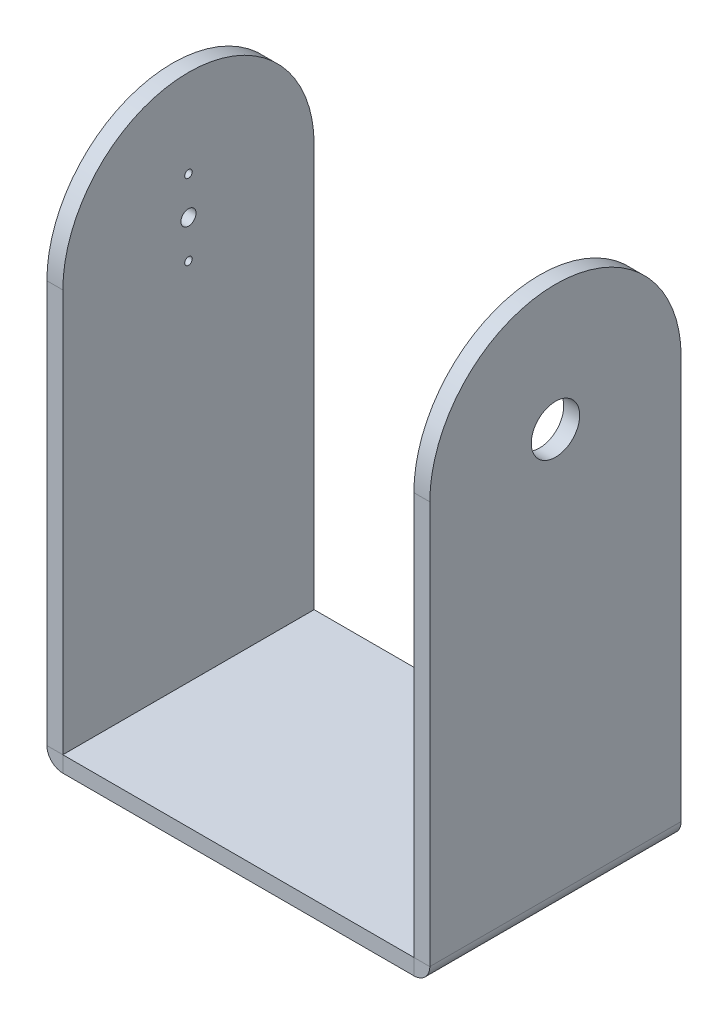
ISO-10303-21;
HEADER;
FILE_DESCRIPTION(('STEP AP214'),'2;1');
FILE_NAME('part.step','',(''),(''),'','','');
FILE_SCHEMA(('AUTOMOTIVE_DESIGN { 1 0 10303 214 1 1 1 1 }'));
ENDSEC;
DATA;
#1=APPLICATION_CONTEXT('core data for automotive mechanical design processes');
#2=APPLICATION_PROTOCOL_DEFINITION('international standard','automotive_design',2000,#1);
#3=PRODUCT_CONTEXT('',#1,'mechanical');
#4=PRODUCT('Part','Part','',(#3));
#5=PRODUCT_RELATED_PRODUCT_CATEGORY('part','',(#4));
#6=PRODUCT_DEFINITION_FORMATION('','',#4);
#7=PRODUCT_DEFINITION_CONTEXT('part definition',#1,'design');
#8=PRODUCT_DEFINITION('design','',#6,#7);
#9=PRODUCT_DEFINITION_SHAPE('','',#8);
#10=(LENGTH_UNIT() NAMED_UNIT(*) SI_UNIT(.MILLI.,.METRE.));
#11=(NAMED_UNIT(*) PLANE_ANGLE_UNIT() SI_UNIT($,.RADIAN.));
#12=(NAMED_UNIT(*) SI_UNIT($,.STERADIAN.) SOLID_ANGLE_UNIT());
#13=UNCERTAINTY_MEASURE_WITH_UNIT(LENGTH_MEASURE(1.E-05),#10,'distance_accuracy_value','');
#14=(GEOMETRIC_REPRESENTATION_CONTEXT(3) GLOBAL_UNCERTAINTY_ASSIGNED_CONTEXT((#13)) GLOBAL_UNIT_ASSIGNED_CONTEXT((#10,
#11,#12)) REPRESENTATION_CONTEXT('',''));
#15=CARTESIAN_POINT('',(0.,0.,0.));
#16=DIRECTION('',(0.,0.,1.));
#17=DIRECTION('',(1.,0.,0.));
#18=AXIS2_PLACEMENT_3D('',#15,#16,#17);
#19=CARTESIAN_POINT('',(-38.0950000000001,-44.918,0.));
#20=DIRECTION('',(1.,0.,0.));
#21=DIRECTION('',(0.,0.,1.));
#22=AXIS2_PLACEMENT_3D('',#19,#20,#21);
#23=PLANE('',#22);
#24=CARTESIAN_POINT('',(-38.0949999999997,72.582,25.));
#25=DIRECTION('',(-1.,0.,0.));
#26=DIRECTION('',(0.,-1.,0.));
#27=AXIS2_PLACEMENT_3D('',#24,#25,#26);
#28=CIRCLE('',#27,0.750000000000002);
#29=CARTESIAN_POINT('',(-38.0949999999997,71.832,25.));
#30=VERTEX_POINT('',#29);
#31=EDGE_CURVE('E228',#30,#30,#28,.T.);
#32=ORIENTED_EDGE('',*,*,#31,.F.);
#33=EDGE_LOOP('',(#32));
#34=FACE_BOUND('',#33,.T.);
#35=CARTESIAN_POINT('',(-38.0949999999997,87.582,25.));
#36=DIRECTION('',(-1.,0.,0.));
#37=DIRECTION('',(0.,-1.,0.));
#38=AXIS2_PLACEMENT_3D('',#35,#36,#37);
#39=CIRCLE('',#38,0.750000000000002);
#40=CARTESIAN_POINT('',(-38.0949999999997,86.832,25.));
#41=VERTEX_POINT('',#40);
#42=EDGE_CURVE('E218',#41,#41,#39,.T.);
#43=ORIENTED_EDGE('',*,*,#42,.F.);
#44=EDGE_LOOP('',(#43));
#45=FACE_BOUND('',#44,.T.);
#46=CARTESIAN_POINT('',(-38.0949999999997,80.082,25.));
#47=DIRECTION('',(-1.,0.,0.));
#48=DIRECTION('',(0.,-1.,0.));
#49=AXIS2_PLACEMENT_3D('',#46,#47,#48);
#50=CIRCLE('',#49,1.5);
#51=CARTESIAN_POINT('',(-38.0949999999997,78.582,25.));
#52=VERTEX_POINT('',#51);
#53=EDGE_CURVE('E215',#52,#52,#50,.T.);
#54=ORIENTED_EDGE('',*,*,#53,.F.);
#55=EDGE_LOOP('',(#54));
#56=FACE_BOUND('',#55,.T.);
#57=DIRECTION('',(0.,-1.,0.));
#58=VECTOR('',#57,1.);
#59=CARTESIAN_POINT('',(-38.0949999999996,105.082,50.));
#60=LINE('',#59,#58);
#61=CARTESIAN_POINT('',(-38.0949999999997,80.082,50.));
#62=VERTEX_POINT('',#61);
#63=CARTESIAN_POINT('',(-38.095,0.00100000000002876,50.));
#64=VERTEX_POINT('',#63);
#65=EDGE_CURVE('E157',#62,#64,#60,.T.);
#66=ORIENTED_EDGE('',*,*,#65,.F.);
#67=CARTESIAN_POINT('',(-38.0949999999997,80.082,25.));
#68=DIRECTION('',(1.,0.,0.));
#69=DIRECTION('',(0.,1.,0.));
#70=AXIS2_PLACEMENT_3D('',#67,#68,#69);
#71=CIRCLE('',#70,25.);
#72=CARTESIAN_POINT('',(-38.0949999999997,80.082,0.));
#73=VERTEX_POINT('',#72);
#74=EDGE_CURVE('E140',#73,#62,#71,.T.);
#75=ORIENTED_EDGE('',*,*,#74,.F.);
#76=DIRECTION('',(0.,1.,0.));
#77=VECTOR('',#76,1.);
#78=CARTESIAN_POINT('',(-38.0949999999996,105.082,0.));
#79=LINE('',#78,#77);
#80=CARTESIAN_POINT('',(-38.095,0.00100000000000881,0.));
#81=VERTEX_POINT('',#80);
#82=EDGE_CURVE('E179',#81,#73,#79,.T.);
#83=ORIENTED_EDGE('',*,*,#82,.F.);
#84=DIRECTION('',(0.,0.,-1.));
#85=VECTOR('',#84,1.);
#86=CARTESIAN_POINT('',(-38.095,0.00100000000002182,0.));
#87=LINE('',#86,#85);
#88=EDGE_CURVE('E162',#64,#81,#87,.T.);
#89=ORIENTED_EDGE('',*,*,#88,.F.);
#90=EDGE_LOOP('',(#66,#75,#83,#89));
#91=FACE_BOUND('',#90,.T.);
#92=ADVANCED_FACE('F44',(#34,#45,#56,#91),#23,.F.);
#93=CARTESIAN_POINT('',(-34.9200000000002,-44.918,0.));
#94=DIRECTION('',(1.,0.,0.));
#95=DIRECTION('',(0.,0.,1.));
#96=AXIS2_PLACEMENT_3D('',#93,#94,#95);
#97=PLANE('',#96);
#98=CARTESIAN_POINT('',(-34.9199999999997,72.582,25.));
#99=DIRECTION('',(1.,0.,0.));
#100=DIRECTION('',(0.,1.,0.));
#101=AXIS2_PLACEMENT_3D('',#98,#99,#100);
#102=CIRCLE('',#101,0.750000000000002);
#103=CARTESIAN_POINT('',(-34.9199999999997,73.332,25.));
#104=VERTEX_POINT('',#103);
#105=EDGE_CURVE('E48',#104,#104,#102,.T.);
#106=ORIENTED_EDGE('',*,*,#105,.F.);
#107=EDGE_LOOP('',(#106));
#108=FACE_BOUND('',#107,.T.);
#109=CARTESIAN_POINT('',(-34.9199999999997,87.582,25.));
#110=DIRECTION('',(1.,0.,0.));
#111=DIRECTION('',(0.,1.,0.));
#112=AXIS2_PLACEMENT_3D('',#109,#110,#111);
#113=CIRCLE('',#112,0.750000000000002);
#114=CARTESIAN_POINT('',(-34.9199999999997,88.332,25.));
#115=VERTEX_POINT('',#114);
#116=EDGE_CURVE('E216',#115,#115,#113,.T.);
#117=ORIENTED_EDGE('',*,*,#116,.F.);
#118=EDGE_LOOP('',(#117));
#119=FACE_BOUND('',#118,.T.);
#120=CARTESIAN_POINT('',(-34.9199999999997,80.082,25.));
#121=DIRECTION('',(1.,0.,0.));
#122=DIRECTION('',(0.,1.,0.));
#123=AXIS2_PLACEMENT_3D('',#120,#121,#122);
#124=CIRCLE('',#123,1.5);
#125=CARTESIAN_POINT('',(-34.9199999999997,81.582,25.));
#126=VERTEX_POINT('',#125);
#127=EDGE_CURVE('E213',#126,#126,#124,.T.);
#128=ORIENTED_EDGE('',*,*,#127,.F.);
#129=EDGE_LOOP('',(#128));
#130=FACE_BOUND('',#129,.T.);
#131=CARTESIAN_POINT('',(-34.9199999999997,80.082,25.));
#132=DIRECTION('',(1.,0.,0.));
#133=DIRECTION('',(0.,1.,0.));
#134=AXIS2_PLACEMENT_3D('',#131,#132,#133);
#135=CIRCLE('',#134,25.);
#136=CARTESIAN_POINT('',(-34.9199999999997,80.082,0.));
#137=VERTEX_POINT('',#136);
#138=CARTESIAN_POINT('',(-34.9199999999998,80.082,50.));
#139=VERTEX_POINT('',#138);
#140=EDGE_CURVE('E69',#137,#139,#135,.T.);
#141=ORIENTED_EDGE('',*,*,#140,.T.);
#142=DIRECTION('',(0.,-1.,0.));
#143=VECTOR('',#142,1.);
#144=CARTESIAN_POINT('',(-34.9199999999996,105.082,50.));
#145=LINE('',#144,#143);
#146=CARTESIAN_POINT('',(-34.92,0.00100000000001488,50.));
#147=VERTEX_POINT('',#146);
#148=EDGE_CURVE('E137',#139,#147,#145,.T.);
#149=ORIENTED_EDGE('',*,*,#148,.T.);
#150=DIRECTION('',(0.,0.,-1.));
#151=VECTOR('',#150,1.);
#152=CARTESIAN_POINT('',(-34.92,0.00100000000000794,0.));
#153=LINE('',#152,#151);
#154=CARTESIAN_POINT('',(-34.92,0.00100000000001488,0.));
#155=VERTEX_POINT('',#154);
#156=EDGE_CURVE('E154',#147,#155,#153,.T.);
#157=ORIENTED_EDGE('',*,*,#156,.T.);
#158=DIRECTION('',(0.,1.,0.));
#159=VECTOR('',#158,1.);
#160=CARTESIAN_POINT('',(-34.9199999999996,105.082,0.));
#161=LINE('',#160,#159);
#162=EDGE_CURVE('E139',#155,#137,#161,.T.);
#163=ORIENTED_EDGE('',*,*,#162,.T.);
#164=EDGE_LOOP('',(#141,#149,#157,#163));
#165=FACE_BOUND('',#164,.T.);
#166=ADVANCED_FACE('F134',(#108,#119,#130,#165),#97,.T.);
#167=CARTESIAN_POINT('',(38.0950000000002,-44.918,0.));
#168=DIRECTION('',(-1.,0.,0.));
#169=DIRECTION('',(0.,0.,1.));
#170=AXIS2_PLACEMENT_3D('',#167,#168,#169);
#171=PLANE('',#170);
#172=CARTESIAN_POINT('',(38.0949999999997,80.082,25.));
#173=DIRECTION('',(1.,0.,0.));
#174=DIRECTION('',(0.,1.,0.));
#175=AXIS2_PLACEMENT_3D('',#172,#173,#174);
#176=CIRCLE('',#175,4.815);
#177=CARTESIAN_POINT('',(38.0949999999997,84.897,25.));
#178=VERTEX_POINT('',#177);
#179=EDGE_CURVE('E212',#178,#178,#176,.T.);
#180=ORIENTED_EDGE('',*,*,#179,.F.);
#181=EDGE_LOOP('',(#180));
#182=FACE_BOUND('',#181,.T.);
#183=CARTESIAN_POINT('',(38.0949999999997,80.0819999999998,24.9999999999999));
#184=DIRECTION('',(-1.,0.,0.));
#185=DIRECTION('',(0.,-1.,0.));
#186=AXIS2_PLACEMENT_3D('',#183,#184,#185);
#187=CIRCLE('',#186,25.);
#188=CARTESIAN_POINT('',(38.0949999999997,80.0819999999998,49.9999999999999));
#189=VERTEX_POINT('',#188);
#190=CARTESIAN_POINT('',(38.0949999999997,80.0819999999998,0.));
#191=VERTEX_POINT('',#190);
#192=EDGE_CURVE('E323',#189,#191,#187,.T.);
#193=ORIENTED_EDGE('',*,*,#192,.F.);
#194=DIRECTION('',(0.,1.,0.));
#195=VECTOR('',#194,1.);
#196=CARTESIAN_POINT('',(38.0950000000007,-194.918,50.));
#197=LINE('',#196,#195);
#198=CARTESIAN_POINT('',(38.095,0.00100000000001575,50.));
#199=VERTEX_POINT('',#198);
#200=EDGE_CURVE('E234',#199,#189,#197,.T.);
#201=ORIENTED_EDGE('',*,*,#200,.F.);
#202=DIRECTION('',(0.,0.,-1.));
#203=VECTOR('',#202,1.);
#204=CARTESIAN_POINT('',(38.095,0.001000000000001,0.));
#205=LINE('',#204,#203);
#206=CARTESIAN_POINT('',(38.095,0.00100000000001488,0.));
#207=VERTEX_POINT('',#206);
#208=EDGE_CURVE('E245',#199,#207,#205,.T.);
#209=ORIENTED_EDGE('',*,*,#208,.T.);
#210=DIRECTION('',(0.,-1.,0.));
#211=VECTOR('',#210,1.);
#212=CARTESIAN_POINT('',(38.0950000000007,-194.918,0.));
#213=LINE('',#212,#211);
#214=EDGE_CURVE('E243',#191,#207,#213,.T.);
#215=ORIENTED_EDGE('',*,*,#214,.F.);
#216=EDGE_LOOP('',(#193,#201,#209,#215));
#217=FACE_BOUND('',#216,.T.);
#218=ADVANCED_FACE('F321',(#182,#217),#171,.F.);
#219=CARTESIAN_POINT('',(34.9200000000002,-44.918,0.));
#220=DIRECTION('',(-1.,0.,0.));
#221=DIRECTION('',(0.,0.,1.));
#222=AXIS2_PLACEMENT_3D('',#219,#220,#221);
#223=PLANE('',#222);
#224=CARTESIAN_POINT('',(34.9199999999997,80.082,25.));
#225=DIRECTION('',(-1.,0.,0.));
#226=DIRECTION('',(0.,-1.,0.));
#227=AXIS2_PLACEMENT_3D('',#224,#225,#226);
#228=CIRCLE('',#227,4.815);
#229=CARTESIAN_POINT('',(34.9199999999997,75.267,25.));
#230=VERTEX_POINT('',#229);
#231=EDGE_CURVE('E208',#230,#230,#228,.T.);
#232=ORIENTED_EDGE('',*,*,#231,.F.);
#233=EDGE_LOOP('',(#232));
#234=FACE_BOUND('',#233,.T.);
#235=DIRECTION('',(0.,1.,0.));
#236=VECTOR('',#235,1.);
#237=CARTESIAN_POINT('',(34.9200000000007,-194.918,50.));
#238=LINE('',#237,#236);
#239=CARTESIAN_POINT('',(34.92,0.000999999999994061,50.));
#240=VERTEX_POINT('',#239);
#241=CARTESIAN_POINT('',(34.9199999999998,80.0819999999997,49.9999999999999));
#242=VERTEX_POINT('',#241);
#243=EDGE_CURVE('E240',#240,#242,#238,.T.);
#244=ORIENTED_EDGE('',*,*,#243,.T.);
#245=CARTESIAN_POINT('',(34.9199999999997,80.0819999999997,24.9999999999999));
#246=DIRECTION('',(-1.,0.,0.));
#247=DIRECTION('',(0.,-1.,0.));
#248=AXIS2_PLACEMENT_3D('',#245,#246,#247);
#249=CIRCLE('',#248,25.);
#250=CARTESIAN_POINT('',(34.9199999999997,80.0819999999997,0.));
#251=VERTEX_POINT('',#250);
#252=EDGE_CURVE('E325',#242,#251,#249,.T.);
#253=ORIENTED_EDGE('',*,*,#252,.T.);
#254=DIRECTION('',(0.,-1.,0.));
#255=VECTOR('',#254,1.);
#256=CARTESIAN_POINT('',(34.9200000000007,-194.918,0.));
#257=LINE('',#256,#255);
#258=CARTESIAN_POINT('',(34.92,0.001000000000001,0.));
#259=VERTEX_POINT('',#258);
#260=EDGE_CURVE('E238',#251,#259,#257,.T.);
#261=ORIENTED_EDGE('',*,*,#260,.T.);
#262=DIRECTION('',(0.,0.,-1.));
#263=VECTOR('',#262,1.);
#264=CARTESIAN_POINT('',(34.92,0.000999999999987122,0.));
#265=LINE('',#264,#263);
#266=EDGE_CURVE('E251',#240,#259,#265,.T.);
#267=ORIENTED_EDGE('',*,*,#266,.F.);
#268=EDGE_LOOP('',(#244,#253,#261,#267));
#269=FACE_BOUND('',#268,.T.);
#270=ADVANCED_FACE('F362',(#234,#269),#223,.T.);
#271=CARTESIAN_POINT('',(38.0950000000007,-194.918,50.));
#272=DIRECTION('',(0.,0.,1.));
#273=DIRECTION('',(0.,1.,0.));
#274=AXIS2_PLACEMENT_3D('',#271,#272,#273);
#275=PLANE('',#274);
#276=ORIENTED_EDGE('',*,*,#200,.T.);
#277=DIRECTION('',(-1.,0.,0.));
#278=VECTOR('',#277,1.);
#279=CARTESIAN_POINT('',(34.9199999999998,80.0819999999997,49.9999999999999));
#280=LINE('',#279,#278);
#281=EDGE_CURVE('E148',#242,#189,#280,.F.);
#282=ORIENTED_EDGE('',*,*,#281,.F.);
#283=ORIENTED_EDGE('',*,*,#243,.F.);
#284=DIRECTION('',(-1.,0.,0.));
#285=VECTOR('',#284,1.);
#286=CARTESIAN_POINT('',(38.095,0.00100000000000794,50.));
#287=LINE('',#286,#285);
#288=EDGE_CURVE('E211',#199,#240,#287,.T.);
#289=ORIENTED_EDGE('',*,*,#288,.F.);
#290=EDGE_LOOP('',(#276,#282,#283,#289));
#291=FACE_BOUND('',#290,.T.);
#292=ADVANCED_FACE('F318',(#291),#275,.T.);
#293=CARTESIAN_POINT('',(-38.0949999999996,105.082,0.));
#294=DIRECTION('',(0.,0.,-1.));
#295=DIRECTION('',(0.,1.,0.));
#296=AXIS2_PLACEMENT_3D('',#293,#294,#295);
#297=PLANE('',#296);
#298=ORIENTED_EDGE('',*,*,#82,.T.);
#299=DIRECTION('',(1.,0.,0.));
#300=VECTOR('',#299,1.);
#301=CARTESIAN_POINT('',(-34.9199999999997,80.082,0.));
#302=LINE('',#301,#300);
#303=EDGE_CURVE('E332',#137,#73,#302,.F.);
#304=ORIENTED_EDGE('',*,*,#303,.F.);
#305=ORIENTED_EDGE('',*,*,#162,.F.);
#306=DIRECTION('',(-1.,0.,0.));
#307=VECTOR('',#306,1.);
#308=CARTESIAN_POINT('',(-38.095,0.00100000000002876,0.));
#309=LINE('',#308,#307);
#310=EDGE_CURVE('E267',#155,#81,#309,.T.);
#311=ORIENTED_EDGE('',*,*,#310,.T.);
#312=EDGE_LOOP('',(#298,#304,#305,#311));
#313=FACE_BOUND('',#312,.T.);
#314=ADVANCED_FACE('F271',(#313),#297,.T.);
#315=CARTESIAN_POINT('',(0.,0.,0.));
#316=DIRECTION('',(0.,1.,0.));
#317=DIRECTION('',(0.,0.,1.));
#318=AXIS2_PLACEMENT_3D('',#315,#316,#317);
#319=PLANE('',#318);
#320=DIRECTION('',(1.,0.,0.));
#321=VECTOR('',#320,1.);
#322=CARTESIAN_POINT('',(-150.,0.,50.));
#323=LINE('',#322,#321);
#324=CARTESIAN_POINT('',(-34.919,0.,50.));
#325=VERTEX_POINT('',#324);
#326=CARTESIAN_POINT('',(34.919,0.,50.));
#327=VERTEX_POINT('',#326);
#328=EDGE_CURVE('E203',#325,#327,#323,.T.);
#329=ORIENTED_EDGE('',*,*,#328,.T.);
#330=DIRECTION('',(0.,0.,-1.));
#331=VECTOR('',#330,1.);
#332=CARTESIAN_POINT('',(34.919,0.,0.));
#333=LINE('',#332,#331);
#334=CARTESIAN_POINT('',(34.919,0.,0.));
#335=VERTEX_POINT('',#334);
#336=EDGE_CURVE('E53',#327,#335,#333,.T.);
#337=ORIENTED_EDGE('',*,*,#336,.T.);
#338=DIRECTION('',(-1.,0.,0.));
#339=VECTOR('',#338,1.);
#340=CARTESIAN_POINT('',(-150.,0.,0.));
#341=LINE('',#340,#339);
#342=CARTESIAN_POINT('',(-34.919,0.,0.));
#343=VERTEX_POINT('',#342);
#344=EDGE_CURVE('E173',#335,#343,#341,.T.);
#345=ORIENTED_EDGE('',*,*,#344,.T.);
#346=DIRECTION('',(0.,0.,-1.));
#347=VECTOR('',#346,1.);
#348=CARTESIAN_POINT('',(-34.919,0.,0.));
#349=LINE('',#348,#347);
#350=EDGE_CURVE('E186',#325,#343,#349,.T.);
#351=ORIENTED_EDGE('',*,*,#350,.F.);
#352=EDGE_LOOP('',(#329,#337,#345,#351));
#353=FACE_BOUND('',#352,.T.);
#354=ADVANCED_FACE('F299',(#353),#319,.T.);
#355=CARTESIAN_POINT('',(-150.,-3.175,0.));
#356=DIRECTION('',(0.,0.,-1.));
#357=DIRECTION('',(-1.,0.,0.));
#358=AXIS2_PLACEMENT_3D('',#355,#356,#357);
#359=PLANE('',#358);
#360=ORIENTED_EDGE('',*,*,#344,.F.);
#361=DIRECTION('',(0.,-1.,0.));
#362=VECTOR('',#361,1.);
#363=CARTESIAN_POINT('',(34.919,-3.175,0.));
#364=LINE('',#363,#362);
#365=CARTESIAN_POINT('',(34.919,-3.175,0.));
#366=VERTEX_POINT('',#365);
#367=EDGE_CURVE('E194',#335,#366,#364,.T.);
#368=ORIENTED_EDGE('',*,*,#367,.T.);
#369=DIRECTION('',(-1.,0.,0.));
#370=VECTOR('',#369,1.);
#371=CARTESIAN_POINT('',(-150.,-3.175,0.));
#372=LINE('',#371,#370);
#373=CARTESIAN_POINT('',(-34.919,-3.175,0.));
#374=VERTEX_POINT('',#373);
#375=EDGE_CURVE('E201',#366,#374,#372,.T.);
#376=ORIENTED_EDGE('',*,*,#375,.T.);
#377=DIRECTION('',(0.,-1.,0.));
#378=VECTOR('',#377,1.);
#379=CARTESIAN_POINT('',(-34.919,-3.175,0.));
#380=LINE('',#379,#378);
#381=EDGE_CURVE('E189',#343,#374,#380,.T.);
#382=ORIENTED_EDGE('',*,*,#381,.F.);
#383=EDGE_LOOP('',(#360,#368,#376,#382));
#384=FACE_BOUND('',#383,.T.);
#385=ADVANCED_FACE('F285',(#384),#359,.T.);
#386=CARTESIAN_POINT('',(-150.,-3.175,50.));
#387=DIRECTION('',(0.,0.,1.));
#388=DIRECTION('',(1.,0.,0.));
#389=AXIS2_PLACEMENT_3D('',#386,#387,#388);
#390=PLANE('',#389);
#391=DIRECTION('',(1.,0.,0.));
#392=VECTOR('',#391,1.);
#393=CARTESIAN_POINT('',(-150.,-3.175,50.));
#394=LINE('',#393,#392);
#395=CARTESIAN_POINT('',(-34.919,-3.175,50.));
#396=VERTEX_POINT('',#395);
#397=CARTESIAN_POINT('',(34.919,-3.175,50.));
#398=VERTEX_POINT('',#397);
#399=EDGE_CURVE('E183',#396,#398,#394,.T.);
#400=ORIENTED_EDGE('',*,*,#399,.T.);
#401=DIRECTION('',(0.,1.,0.));
#402=VECTOR('',#401,1.);
#403=CARTESIAN_POINT('',(34.919,-3.175,50.));
#404=LINE('',#403,#402);
#405=EDGE_CURVE('E12',#398,#327,#404,.T.);
#406=ORIENTED_EDGE('',*,*,#405,.T.);
#407=ORIENTED_EDGE('',*,*,#328,.F.);
#408=DIRECTION('',(0.,1.,0.));
#409=VECTOR('',#408,1.);
#410=CARTESIAN_POINT('',(-34.919,-3.175,50.));
#411=LINE('',#410,#409);
#412=EDGE_CURVE('E182',#396,#325,#411,.T.);
#413=ORIENTED_EDGE('',*,*,#412,.F.);
#414=EDGE_LOOP('',(#400,#406,#407,#413));
#415=FACE_BOUND('',#414,.T.);
#416=ADVANCED_FACE('F46',(#415),#390,.T.);
#417=CARTESIAN_POINT('',(0.,-3.175,0.));
#418=DIRECTION('',(0.,1.,0.));
#419=DIRECTION('',(0.,0.,1.));
#420=AXIS2_PLACEMENT_3D('',#417,#418,#419);
#421=PLANE('',#420);
#422=DIRECTION('',(0.,0.,-1.));
#423=VECTOR('',#422,1.);
#424=CARTESIAN_POINT('',(34.919,-3.175,0.));
#425=LINE('',#424,#423);
#426=EDGE_CURVE('E192',#398,#366,#425,.T.);
#427=ORIENTED_EDGE('',*,*,#426,.F.);
#428=ORIENTED_EDGE('',*,*,#399,.F.);
#429=DIRECTION('',(0.,0.,-1.));
#430=VECTOR('',#429,1.);
#431=CARTESIAN_POINT('',(-34.919,-3.175,0.));
#432=LINE('',#431,#430);
#433=EDGE_CURVE('E180',#396,#374,#432,.T.);
#434=ORIENTED_EDGE('',*,*,#433,.T.);
#435=ORIENTED_EDGE('',*,*,#375,.F.);
#436=EDGE_LOOP('',(#427,#428,#434,#435));
#437=FACE_BOUND('',#436,.T.);
#438=ADVANCED_FACE('F289',(#437),#421,.F.);
#439=CARTESIAN_POINT('',(-34.919,0.00100000000000013,50.));
#440=DIRECTION('',(0.,0.,1.));
#441=DIRECTION('',(1.,0.,0.));
#442=AXIS2_PLACEMENT_3D('',#439,#440,#441);
#443=PLANE('',#442);
#444=ORIENTED_EDGE('',*,*,#412,.T.);
#445=CARTESIAN_POINT('',(-34.919,0.00100000000000013,50.));
#446=DIRECTION('',(0.,0.,-1.));
#447=DIRECTION('',(-1.,0.,0.));
#448=AXIS2_PLACEMENT_3D('',#445,#446,#447);
#449=CIRCLE('',#448,0.00100000000000013);
#450=EDGE_CURVE('E176',#325,#147,#449,.T.);
#451=ORIENTED_EDGE('',*,*,#450,.T.);
#452=DIRECTION('',(1.,0.,0.));
#453=VECTOR('',#452,1.);
#454=CARTESIAN_POINT('',(-38.095,0.00100000000002876,50.));
#455=LINE('',#454,#453);
#456=EDGE_CURVE('E152',#64,#147,#455,.T.);
#457=ORIENTED_EDGE('',*,*,#456,.F.);
#458=CARTESIAN_POINT('',(-34.919,0.00100000000000013,50.));
#459=DIRECTION('',(0.,0.,-1.));
#460=DIRECTION('',(1.,0.,0.));
#461=AXIS2_PLACEMENT_3D('',#458,#459,#460);
#462=CIRCLE('',#461,3.176);
#463=EDGE_CURVE('E166',#396,#64,#462,.T.);
#464=ORIENTED_EDGE('',*,*,#463,.F.);
#465=EDGE_LOOP('',(#444,#451,#457,#464));
#466=FACE_BOUND('',#465,.T.);
#467=ADVANCED_FACE('F295',(#466),#443,.T.);
#468=CARTESIAN_POINT('',(-34.919,0.00100000000000013,0.));
#469=DIRECTION('',(0.,0.,-1.));
#470=DIRECTION('',(-1.,0.,0.));
#471=AXIS2_PLACEMENT_3D('',#468,#469,#470);
#472=PLANE('',#471);
#473=ORIENTED_EDGE('',*,*,#310,.F.);
#474=CARTESIAN_POINT('',(-34.919,0.00100000000000013,0.));
#475=DIRECTION('',(0.,0.,-1.));
#476=DIRECTION('',(-1.,0.,0.));
#477=AXIS2_PLACEMENT_3D('',#474,#475,#476);
#478=CIRCLE('',#477,0.00100000000000013);
#479=EDGE_CURVE('E170',#155,#343,#478,.F.);
#480=ORIENTED_EDGE('',*,*,#479,.T.);
#481=ORIENTED_EDGE('',*,*,#381,.T.);
#482=CARTESIAN_POINT('',(-34.919,0.00100000000000013,0.));
#483=DIRECTION('',(0.,0.,1.));
#484=DIRECTION('',(-1.,0.,0.));
#485=AXIS2_PLACEMENT_3D('',#482,#483,#484);
#486=CIRCLE('',#485,3.176);
#487=EDGE_CURVE('E169',#81,#374,#486,.T.);
#488=ORIENTED_EDGE('',*,*,#487,.F.);
#489=EDGE_LOOP('',(#473,#480,#481,#488));
#490=FACE_BOUND('',#489,.T.);
#491=ADVANCED_FACE('F281',(#490),#472,.T.);
#492=CARTESIAN_POINT('',(-34.919,0.00100000000000013,76.0889481688555));
#493=DIRECTION('',(0.,0.,-1.));
#494=DIRECTION('',(-1.,0.,0.));
#495=AXIS2_PLACEMENT_3D('',#492,#493,#494);
#496=CYLINDRICAL_SURFACE('',#495,3.176);
#497=ORIENTED_EDGE('',*,*,#487,.T.);
#498=ORIENTED_EDGE('',*,*,#433,.F.);
#499=ORIENTED_EDGE('',*,*,#463,.T.);
#500=ORIENTED_EDGE('',*,*,#88,.T.);
#501=EDGE_LOOP('',(#497,#498,#499,#500));
#502=FACE_BOUND('',#501,.T.);
#503=ADVANCED_FACE('F278',(#502),#496,.T.);
#504=CARTESIAN_POINT('',(-34.919,0.00100000000000013,76.0889481688555));
#505=DIRECTION('',(0.,0.,-1.));
#506=DIRECTION('',(-1.,0.,0.));
#507=AXIS2_PLACEMENT_3D('',#504,#505,#506);
#508=CYLINDRICAL_SURFACE('',#507,0.00100000000000013);
#509=ORIENTED_EDGE('',*,*,#479,.F.);
#510=ORIENTED_EDGE('',*,*,#156,.F.);
#511=ORIENTED_EDGE('',*,*,#450,.F.);
#512=ORIENTED_EDGE('',*,*,#350,.T.);
#513=EDGE_LOOP('',(#509,#510,#511,#512));
#514=FACE_BOUND('',#513,.T.);
#515=ADVANCED_FACE('F297',(#514),#508,.F.);
#516=CARTESIAN_POINT('',(-38.0949999999996,105.082,50.));
#517=DIRECTION('',(0.,0.,1.));
#518=DIRECTION('',(0.,-1.,0.));
#519=AXIS2_PLACEMENT_3D('',#516,#517,#518);
#520=PLANE('',#519);
#521=DIRECTION('',(1.,0.,0.));
#522=VECTOR('',#521,1.);
#523=CARTESIAN_POINT('',(-34.9199999999998,80.082,50.));
#524=LINE('',#523,#522);
#525=EDGE_CURVE('E143',#139,#62,#524,.F.);
#526=ORIENTED_EDGE('',*,*,#525,.T.);
#527=ORIENTED_EDGE('',*,*,#65,.T.);
#528=ORIENTED_EDGE('',*,*,#456,.T.);
#529=ORIENTED_EDGE('',*,*,#148,.F.);
#530=EDGE_LOOP('',(#526,#527,#528,#529));
#531=FACE_BOUND('',#530,.T.);
#532=ADVANCED_FACE('F150',(#531),#520,.T.);
#533=CARTESIAN_POINT('',(34.919,0.00100000000000013,50.));
#534=DIRECTION('',(0.,0.,1.));
#535=DIRECTION('',(1.,0.,0.));
#536=AXIS2_PLACEMENT_3D('',#533,#534,#535);
#537=PLANE('',#536);
#538=ORIENTED_EDGE('',*,*,#288,.T.);
#539=CARTESIAN_POINT('',(34.919,0.00100000000000013,50.));
#540=DIRECTION('',(0.,0.,1.));
#541=DIRECTION('',(1.,0.,0.));
#542=AXIS2_PLACEMENT_3D('',#539,#540,#541);
#543=CIRCLE('',#542,0.00100000000000013);
#544=EDGE_CURVE('E237',#240,#327,#543,.F.);
#545=ORIENTED_EDGE('',*,*,#544,.T.);
#546=ORIENTED_EDGE('',*,*,#405,.F.);
#547=CARTESIAN_POINT('',(34.919,0.00100000000000013,50.));
#548=DIRECTION('',(0.,0.,-1.));
#549=DIRECTION('',(1.,0.,0.));
#550=AXIS2_PLACEMENT_3D('',#547,#548,#549);
#551=CIRCLE('',#550,3.176);
#552=EDGE_CURVE('E256',#199,#398,#551,.T.);
#553=ORIENTED_EDGE('',*,*,#552,.F.);
#554=EDGE_LOOP('',(#538,#545,#546,#553));
#555=FACE_BOUND('',#554,.T.);
#556=ADVANCED_FACE('F315',(#555),#537,.T.);
#557=CARTESIAN_POINT('',(34.919,0.00100000000000013,0.));
#558=DIRECTION('',(0.,0.,-1.));
#559=DIRECTION('',(-1.,0.,0.));
#560=AXIS2_PLACEMENT_3D('',#557,#558,#559);
#561=PLANE('',#560);
#562=CARTESIAN_POINT('',(34.919,0.00100000000000013,0.));
#563=DIRECTION('',(0.,0.,1.));
#564=DIRECTION('',(1.,0.,0.));
#565=AXIS2_PLACEMENT_3D('',#562,#563,#564);
#566=CIRCLE('',#565,0.00100000000000013);
#567=EDGE_CURVE('E259',#335,#259,#566,.T.);
#568=ORIENTED_EDGE('',*,*,#567,.T.);
#569=DIRECTION('',(1.,0.,0.));
#570=VECTOR('',#569,1.);
#571=CARTESIAN_POINT('',(38.095,0.00100000000001488,0.));
#572=LINE('',#571,#570);
#573=EDGE_CURVE('E248',#259,#207,#572,.T.);
#574=ORIENTED_EDGE('',*,*,#573,.T.);
#575=CARTESIAN_POINT('',(34.919,0.00100000000000013,0.));
#576=DIRECTION('',(0.,0.,1.));
#577=DIRECTION('',(-1.,0.,0.));
#578=AXIS2_PLACEMENT_3D('',#575,#576,#577);
#579=CIRCLE('',#578,3.176);
#580=EDGE_CURVE('E165',#366,#207,#579,.T.);
#581=ORIENTED_EDGE('',*,*,#580,.F.);
#582=ORIENTED_EDGE('',*,*,#367,.F.);
#583=EDGE_LOOP('',(#568,#574,#581,#582));
#584=FACE_BOUND('',#583,.T.);
#585=ADVANCED_FACE('F307',(#584),#561,.T.);
#586=CARTESIAN_POINT('',(34.919,0.00100000000000013,-26.0889481688555));
#587=DIRECTION('',(0.,0.,1.));
#588=DIRECTION('',(1.,0.,0.));
#589=AXIS2_PLACEMENT_3D('',#586,#587,#588);
#590=CYLINDRICAL_SURFACE('',#589,3.176);
#591=ORIENTED_EDGE('',*,*,#426,.T.);
#592=ORIENTED_EDGE('',*,*,#580,.T.);
#593=ORIENTED_EDGE('',*,*,#208,.F.);
#594=ORIENTED_EDGE('',*,*,#552,.T.);
#595=EDGE_LOOP('',(#591,#592,#593,#594));
#596=FACE_BOUND('',#595,.T.);
#597=ADVANCED_FACE('F312',(#596),#590,.T.);
#598=CARTESIAN_POINT('',(34.919,0.00100000000000013,-26.0889481688555));
#599=DIRECTION('',(0.,0.,1.));
#600=DIRECTION('',(1.,0.,0.));
#601=AXIS2_PLACEMENT_3D('',#598,#599,#600);
#602=CYLINDRICAL_SURFACE('',#601,0.00100000000000013);
#603=ORIENTED_EDGE('',*,*,#336,.F.);
#604=ORIENTED_EDGE('',*,*,#544,.F.);
#605=ORIENTED_EDGE('',*,*,#266,.T.);
#606=ORIENTED_EDGE('',*,*,#567,.F.);
#607=EDGE_LOOP('',(#603,#604,#605,#606));
#608=FACE_BOUND('',#607,.T.);
#609=ADVANCED_FACE('F304',(#608),#602,.F.);
#610=CARTESIAN_POINT('',(38.0950000000007,-194.918,0.));
#611=DIRECTION('',(0.,0.,-1.));
#612=DIRECTION('',(0.,-1.,0.));
#613=AXIS2_PLACEMENT_3D('',#610,#611,#612);
#614=PLANE('',#613);
#615=DIRECTION('',(-1.,0.,0.));
#616=VECTOR('',#615,1.);
#617=CARTESIAN_POINT('',(34.9199999999997,80.0819999999997,0.));
#618=LINE('',#617,#616);
#619=EDGE_CURVE('E61',#251,#191,#618,.F.);
#620=ORIENTED_EDGE('',*,*,#619,.T.);
#621=ORIENTED_EDGE('',*,*,#214,.T.);
#622=ORIENTED_EDGE('',*,*,#573,.F.);
#623=ORIENTED_EDGE('',*,*,#260,.F.);
#624=EDGE_LOOP('',(#620,#621,#622,#623));
#625=FACE_BOUND('',#624,.T.);
#626=ADVANCED_FACE('F355',(#625),#614,.T.);
#627=CARTESIAN_POINT('',(28.0949999999997,80.082,25.));
#628=DIRECTION('',(1.,0.,0.));
#629=DIRECTION('',(0.,1.,0.));
#630=AXIS2_PLACEMENT_3D('',#627,#628,#629);
#631=CYLINDRICAL_SURFACE('',#630,4.815);
#632=ORIENTED_EDGE('',*,*,#231,.T.);
#633=EDGE_LOOP('',(#632));
#634=FACE_BOUND('',#633,.T.);
#635=ORIENTED_EDGE('',*,*,#179,.T.);
#636=EDGE_LOOP('',(#635));
#637=FACE_BOUND('',#636,.T.);
#638=ADVANCED_FACE('F347',(#634,#637),#631,.F.);
#639=CARTESIAN_POINT('',(-28.0949999999997,80.082,25.));
#640=DIRECTION('',(-1.,0.,0.));
#641=DIRECTION('',(0.,-1.,0.));
#642=AXIS2_PLACEMENT_3D('',#639,#640,#641);
#643=CYLINDRICAL_SURFACE('',#642,1.5);
#644=ORIENTED_EDGE('',*,*,#127,.T.);
#645=EDGE_LOOP('',(#644));
#646=FACE_BOUND('',#645,.T.);
#647=ORIENTED_EDGE('',*,*,#53,.T.);
#648=EDGE_LOOP('',(#647));
#649=FACE_BOUND('',#648,.T.);
#650=ADVANCED_FACE('F344',(#646,#649),#643,.F.);
#651=CARTESIAN_POINT('',(-28.0949999999997,87.582,25.));
#652=DIRECTION('',(-1.,0.,0.));
#653=DIRECTION('',(0.,-1.,0.));
#654=AXIS2_PLACEMENT_3D('',#651,#652,#653);
#655=CYLINDRICAL_SURFACE('',#654,0.750000000000002);
#656=ORIENTED_EDGE('',*,*,#116,.T.);
#657=EDGE_LOOP('',(#656));
#658=FACE_BOUND('',#657,.T.);
#659=ORIENTED_EDGE('',*,*,#42,.T.);
#660=EDGE_LOOP('',(#659));
#661=FACE_BOUND('',#660,.T.);
#662=ADVANCED_FACE('F346',(#658,#661),#655,.F.);
#663=CARTESIAN_POINT('',(-28.0949999999997,72.5819999999999,25.));
#664=DIRECTION('',(-1.,0.,0.));
#665=DIRECTION('',(0.,-1.,0.));
#666=AXIS2_PLACEMENT_3D('',#663,#664,#665);
#667=CYLINDRICAL_SURFACE('',#666,0.750000000000002);
#668=ORIENTED_EDGE('',*,*,#105,.T.);
#669=EDGE_LOOP('',(#668));
#670=FACE_BOUND('',#669,.T.);
#671=ORIENTED_EDGE('',*,*,#31,.T.);
#672=EDGE_LOOP('',(#671));
#673=FACE_BOUND('',#672,.T.);
#674=ADVANCED_FACE('F336',(#670,#673),#667,.F.);
#675=CARTESIAN_POINT('',(-34.9199999999997,80.082,25.));
#676=DIRECTION('',(1.,0.,0.));
#677=DIRECTION('',(0.,1.,0.));
#678=AXIS2_PLACEMENT_3D('',#675,#676,#677);
#679=CYLINDRICAL_SURFACE('',#678,25.);
#680=ORIENTED_EDGE('',*,*,#74,.T.);
#681=ORIENTED_EDGE('',*,*,#525,.F.);
#682=ORIENTED_EDGE('',*,*,#140,.F.);
#683=ORIENTED_EDGE('',*,*,#303,.T.);
#684=EDGE_LOOP('',(#680,#681,#682,#683));
#685=FACE_BOUND('',#684,.T.);
#686=ADVANCED_FACE('F144',(#685),#679,.T.);
#687=CARTESIAN_POINT('',(34.9199999999997,80.0819999999997,24.9999999999999));
#688=DIRECTION('',(-1.,0.,0.));
#689=DIRECTION('',(0.,-1.,0.));
#690=AXIS2_PLACEMENT_3D('',#687,#688,#689);
#691=CYLINDRICAL_SURFACE('',#690,25.);
#692=ORIENTED_EDGE('',*,*,#619,.F.);
#693=ORIENTED_EDGE('',*,*,#252,.F.);
#694=ORIENTED_EDGE('',*,*,#281,.T.);
#695=ORIENTED_EDGE('',*,*,#192,.T.);
#696=EDGE_LOOP('',(#692,#693,#694,#695));
#697=FACE_BOUND('',#696,.T.);
#698=ADVANCED_FACE('F327',(#697),#691,.T.);
#699=CLOSED_SHELL('',(#92,#166,#218,#270,#292,#314,#354,#385,#416,#438,#467,#491,#503,#515,#532,
#556,#585,#597,#609,#626,#638,#650,#662,#674,#686,#698));
#700=MANIFOLD_SOLID_BREP('B2',#699);
#701=ADVANCED_BREP_SHAPE_REPRESENTATION('',(#18,#700),#14);
#702=SHAPE_DEFINITION_REPRESENTATION(#9,#701);
ENDSEC;
END-ISO-10303-21;
